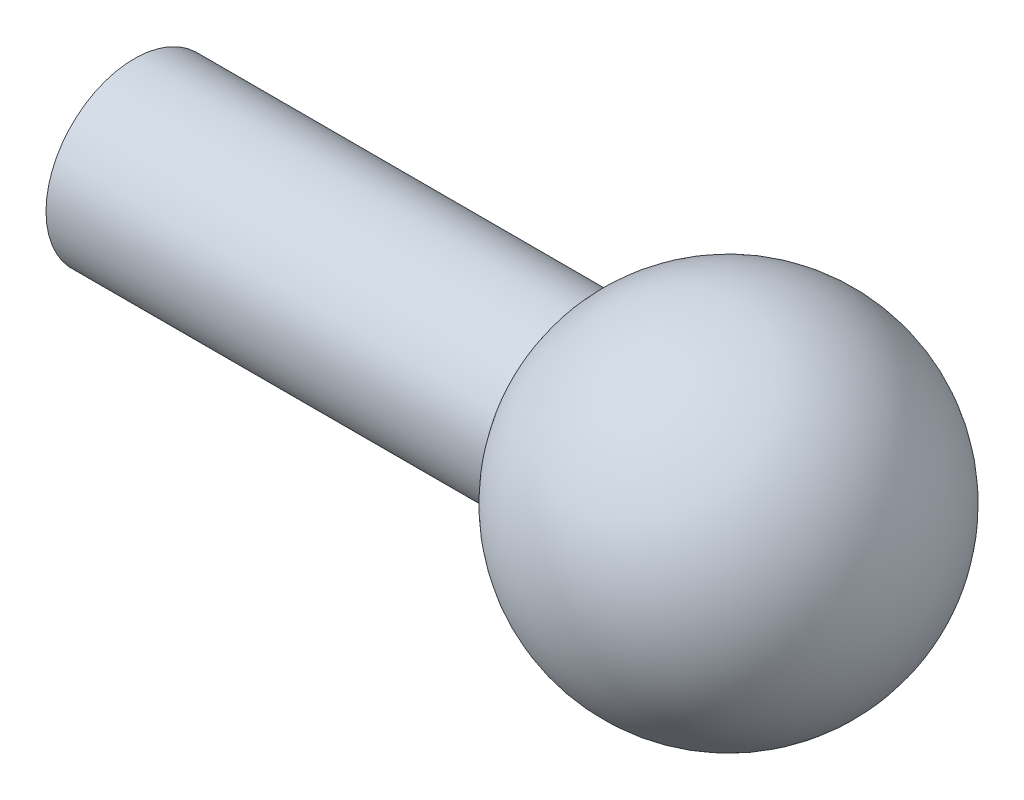
ISO-10303-21;
HEADER;
FILE_DESCRIPTION(('STEP AP214'),'2;1');
FILE_NAME('part.step','',(''),(''),'','','');
FILE_SCHEMA(('AUTOMOTIVE_DESIGN { 1 0 10303 214 1 1 1 1 }'));
ENDSEC;
DATA;
#1=APPLICATION_CONTEXT('core data for automotive mechanical design processes');
#2=APPLICATION_PROTOCOL_DEFINITION('international standard','automotive_design',2000,#1);
#3=PRODUCT_CONTEXT('',#1,'mechanical');
#4=PRODUCT('Part','Part','',(#3));
#5=PRODUCT_RELATED_PRODUCT_CATEGORY('part','',(#4));
#6=PRODUCT_DEFINITION_FORMATION('','',#4);
#7=PRODUCT_DEFINITION_CONTEXT('part definition',#1,'design');
#8=PRODUCT_DEFINITION('design','',#6,#7);
#9=PRODUCT_DEFINITION_SHAPE('','',#8);
#10=(LENGTH_UNIT() NAMED_UNIT(*) SI_UNIT(.MILLI.,.METRE.));
#11=(NAMED_UNIT(*) PLANE_ANGLE_UNIT() SI_UNIT($,.RADIAN.));
#12=(NAMED_UNIT(*) SI_UNIT($,.STERADIAN.) SOLID_ANGLE_UNIT());
#13=UNCERTAINTY_MEASURE_WITH_UNIT(LENGTH_MEASURE(1.E-05),#10,'distance_accuracy_value','');
#14=(GEOMETRIC_REPRESENTATION_CONTEXT(3) GLOBAL_UNCERTAINTY_ASSIGNED_CONTEXT((#13)) GLOBAL_UNIT_ASSIGNED_CONTEXT((#10,
#11,#12)) REPRESENTATION_CONTEXT('',''));
#15=CARTESIAN_POINT('',(0.,0.,0.));
#16=DIRECTION('',(0.,0.,1.));
#17=DIRECTION('',(1.,0.,0.));
#18=AXIS2_PLACEMENT_3D('',#15,#16,#17);
#19=CARTESIAN_POINT('',(10.7494090512249,0.,0.));
#20=DIRECTION('',(-1.,0.,0.));
#21=DIRECTION('',(0.,0.,-1.));
#22=AXIS2_PLACEMENT_3D('',#19,#20,#21);
#23=SPHERICAL_SURFACE('',#22,5.08);
#24=CARTESIAN_POINT('',(6.35,0.,0.));
#25=DIRECTION('',(-1.,0.,0.));
#26=DIRECTION('',(0.,0.,1.));
#27=AXIS2_PLACEMENT_3D('',#24,#25,#26);
#28=CIRCLE('',#27,2.54);
#29=CARTESIAN_POINT('',(6.35,0.,2.54));
#30=VERTEX_POINT('',#29);
#31=EDGE_CURVE('E49',#30,#30,#28,.T.);
#32=ORIENTED_EDGE('',*,*,#31,.F.);
#33=EDGE_LOOP('',(#32));
#34=FACE_BOUND('',#33,.T.);
#35=ADVANCED_FACE('F43',(#34),#23,.T.);
#36=CARTESIAN_POINT('',(-6.35,0.,-2.54));
#37=DIRECTION('',(1.,0.,0.));
#38=DIRECTION('',(0.,0.,-1.));
#39=AXIS2_PLACEMENT_3D('',#36,#37,#38);
#40=PLANE('',#39);
#41=CARTESIAN_POINT('',(-6.35,0.,0.));
#42=DIRECTION('',(-1.,0.,0.));
#43=DIRECTION('',(0.,0.,1.));
#44=AXIS2_PLACEMENT_3D('',#41,#42,#43);
#45=CIRCLE('',#44,2.54);
#46=CARTESIAN_POINT('',(-6.35,0.,2.54));
#47=VERTEX_POINT('',#46);
#48=EDGE_CURVE('E10',#47,#47,#45,.T.);
#49=ORIENTED_EDGE('',*,*,#48,.T.);
#50=EDGE_LOOP('',(#49));
#51=FACE_BOUND('',#50,.T.);
#52=ADVANCED_FACE('F58',(#51),#40,.F.);
#53=CARTESIAN_POINT('',(-6.35,0.,0.));
#54=DIRECTION('',(-1.,0.,0.));
#55=DIRECTION('',(0.,0.,1.));
#56=AXIS2_PLACEMENT_3D('',#53,#54,#55);
#57=CYLINDRICAL_SURFACE('',#56,2.54);
#58=ORIENTED_EDGE('',*,*,#48,.F.);
#59=EDGE_LOOP('',(#58));
#60=FACE_BOUND('',#59,.T.);
#61=ORIENTED_EDGE('',*,*,#31,.T.);
#62=EDGE_LOOP('',(#61));
#63=FACE_BOUND('',#62,.T.);
#64=ADVANCED_FACE('F60',(#60,#63),#57,.T.);
#65=CLOSED_SHELL('',(#35,#52,#64));
#66=MANIFOLD_SOLID_BREP('B2',#65);
#67=ADVANCED_BREP_SHAPE_REPRESENTATION('',(#18,#66),#14);
#68=SHAPE_DEFINITION_REPRESENTATION(#9,#67);
ENDSEC;
END-ISO-10303-21;
